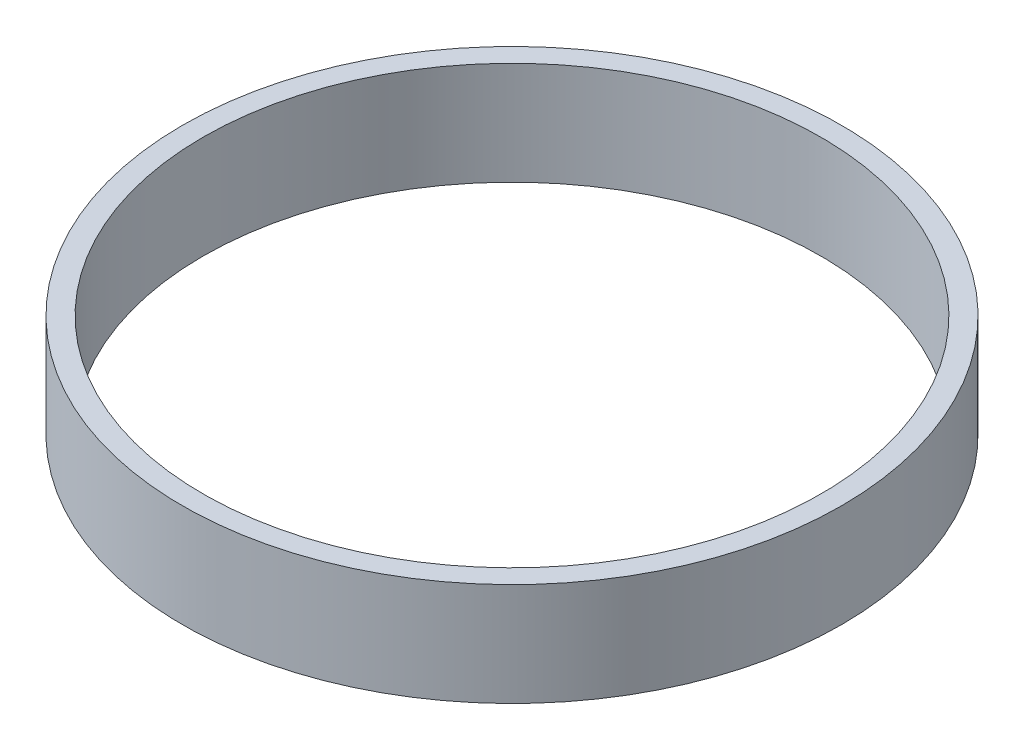
ISO-10303-21;
HEADER;
FILE_DESCRIPTION(('STEP AP214'),'2;1');
FILE_NAME('part.step','',(''),(''),'','','');
FILE_SCHEMA(('AUTOMOTIVE_DESIGN { 1 0 10303 214 1 1 1 1 }'));
ENDSEC;
DATA;
#1=APPLICATION_CONTEXT('core data for automotive mechanical design processes');
#2=APPLICATION_PROTOCOL_DEFINITION('international standard','automotive_design',2000,#1);
#3=PRODUCT_CONTEXT('',#1,'mechanical');
#4=PRODUCT('Part','Part','',(#3));
#5=PRODUCT_RELATED_PRODUCT_CATEGORY('part','',(#4));
#6=PRODUCT_DEFINITION_FORMATION('','',#4);
#7=PRODUCT_DEFINITION_CONTEXT('part definition',#1,'design');
#8=PRODUCT_DEFINITION('design','',#6,#7);
#9=PRODUCT_DEFINITION_SHAPE('','',#8);
#10=(LENGTH_UNIT() NAMED_UNIT(*) SI_UNIT(.MILLI.,.METRE.));
#11=(NAMED_UNIT(*) PLANE_ANGLE_UNIT() SI_UNIT($,.RADIAN.));
#12=(NAMED_UNIT(*) SI_UNIT($,.STERADIAN.) SOLID_ANGLE_UNIT());
#13=UNCERTAINTY_MEASURE_WITH_UNIT(LENGTH_MEASURE(1.E-05),#10,'distance_accuracy_value','');
#14=(GEOMETRIC_REPRESENTATION_CONTEXT(3) GLOBAL_UNCERTAINTY_ASSIGNED_CONTEXT((#13)) GLOBAL_UNIT_ASSIGNED_CONTEXT((#10,
#11,#12)) REPRESENTATION_CONTEXT('',''));
#15=CARTESIAN_POINT('',(0.,0.,0.));
#16=DIRECTION('',(0.,0.,1.));
#17=DIRECTION('',(1.,0.,0.));
#18=AXIS2_PLACEMENT_3D('',#15,#16,#17);
#19=CARTESIAN_POINT('',(0.,0.,0.));
#20=DIRECTION('',(0.,1.,0.));
#21=DIRECTION('',(1.,0.,0.));
#22=AXIS2_PLACEMENT_3D('',#19,#20,#21);
#23=PLANE('',#22);
#24=CARTESIAN_POINT('',(0.,0.,0.));
#25=DIRECTION('',(0.,-1.,0.));
#26=DIRECTION('',(1.,0.,0.));
#27=AXIS2_PLACEMENT_3D('',#24,#25,#26);
#28=CIRCLE('',#27,15.);
#29=CARTESIAN_POINT('',(-15.,0.,0.));
#30=VERTEX_POINT('',#29);
#31=EDGE_CURVE('E55',#30,#30,#28,.T.);
#32=ORIENTED_EDGE('',*,*,#31,.F.);
#33=EDGE_LOOP('',(#32));
#34=FACE_BOUND('',#33,.T.);
#35=CARTESIAN_POINT('',(0.,0.,0.));
#36=DIRECTION('',(0.,1.,0.));
#37=DIRECTION('',(-1.,0.,0.));
#38=AXIS2_PLACEMENT_3D('',#35,#36,#37);
#39=CIRCLE('',#38,16.);
#40=CARTESIAN_POINT('',(16.,0.,0.));
#41=VERTEX_POINT('',#40);
#42=EDGE_CURVE('E11',#41,#41,#39,.T.);
#43=ORIENTED_EDGE('',*,*,#42,.F.);
#44=EDGE_LOOP('',(#43));
#45=FACE_BOUND('',#44,.T.);
#46=ADVANCED_FACE('F17',(#34,#45),#23,.F.);
#47=CARTESIAN_POINT('',(0.,5.,0.));
#48=DIRECTION('',(0.,1.,0.));
#49=DIRECTION('',(1.,0.,0.));
#50=AXIS2_PLACEMENT_3D('',#47,#48,#49);
#51=PLANE('',#50);
#52=CARTESIAN_POINT('',(0.,5.,0.));
#53=DIRECTION('',(0.,-1.,0.));
#54=DIRECTION('',(1.,0.,0.));
#55=AXIS2_PLACEMENT_3D('',#52,#53,#54);
#56=CIRCLE('',#55,15.);
#57=CARTESIAN_POINT('',(-15.,5.,0.));
#58=VERTEX_POINT('',#57);
#59=EDGE_CURVE('E21',#58,#58,#56,.T.);
#60=ORIENTED_EDGE('',*,*,#59,.T.);
#61=EDGE_LOOP('',(#60));
#62=FACE_BOUND('',#61,.T.);
#63=CARTESIAN_POINT('',(0.,5.,0.));
#64=DIRECTION('',(0.,1.,0.));
#65=DIRECTION('',(-1.,0.,0.));
#66=AXIS2_PLACEMENT_3D('',#63,#64,#65);
#67=CIRCLE('',#66,16.);
#68=CARTESIAN_POINT('',(16.,5.,0.));
#69=VERTEX_POINT('',#68);
#70=EDGE_CURVE('E59',#69,#69,#67,.T.);
#71=ORIENTED_EDGE('',*,*,#70,.T.);
#72=EDGE_LOOP('',(#71));
#73=FACE_BOUND('',#72,.T.);
#74=ADVANCED_FACE('F74',(#62,#73),#51,.T.);
#75=CARTESIAN_POINT('',(0.,0.,0.));
#76=DIRECTION('',(0.,1.,0.));
#77=DIRECTION('',(-1.,0.,0.));
#78=AXIS2_PLACEMENT_3D('',#75,#76,#77);
#79=CYLINDRICAL_SURFACE('',#78,16.);
#80=ORIENTED_EDGE('',*,*,#70,.F.);
#81=DIRECTION('',(0.,-1.,0.));
#82=VECTOR('',#81,1.);
#83=CARTESIAN_POINT('',(16.,0.,0.));
#84=LINE('',#83,#82);
#85=EDGE_CURVE('E28',#69,#41,#84,.T.);
#86=ORIENTED_EDGE('',*,*,#85,.T.);
#87=ORIENTED_EDGE('',*,*,#42,.T.);
#88=ORIENTED_EDGE('',*,*,#85,.F.);
#89=EDGE_LOOP('',(#80,#86,#87,#88));
#90=FACE_BOUND('',#89,.T.);
#91=ADVANCED_FACE('F19',(#90),#79,.T.);
#92=CARTESIAN_POINT('',(0.,0.,0.));
#93=DIRECTION('',(0.,1.,0.));
#94=DIRECTION('',(1.,0.,0.));
#95=AXIS2_PLACEMENT_3D('',#92,#93,#94);
#96=CYLINDRICAL_SURFACE('',#95,15.);
#97=ORIENTED_EDGE('',*,*,#59,.F.);
#98=DIRECTION('',(0.,-1.,0.));
#99=VECTOR('',#98,1.);
#100=CARTESIAN_POINT('',(-15.,0.,0.));
#101=LINE('',#100,#99);
#102=EDGE_CURVE('E50',#58,#30,#101,.T.);
#103=ORIENTED_EDGE('',*,*,#102,.T.);
#104=ORIENTED_EDGE('',*,*,#31,.T.);
#105=ORIENTED_EDGE('',*,*,#102,.F.);
#106=EDGE_LOOP('',(#97,#103,#104,#105));
#107=FACE_BOUND('',#106,.T.);
#108=ADVANCED_FACE('F56',(#107),#96,.F.);
#109=CLOSED_SHELL('',(#46,#74,#91,#108));
#110=MANIFOLD_SOLID_BREP('B1',#109);
#111=ADVANCED_BREP_SHAPE_REPRESENTATION('',(#18,#110),#14);
#112=SHAPE_DEFINITION_REPRESENTATION(#9,#111);
ENDSEC;
END-ISO-10303-21;
